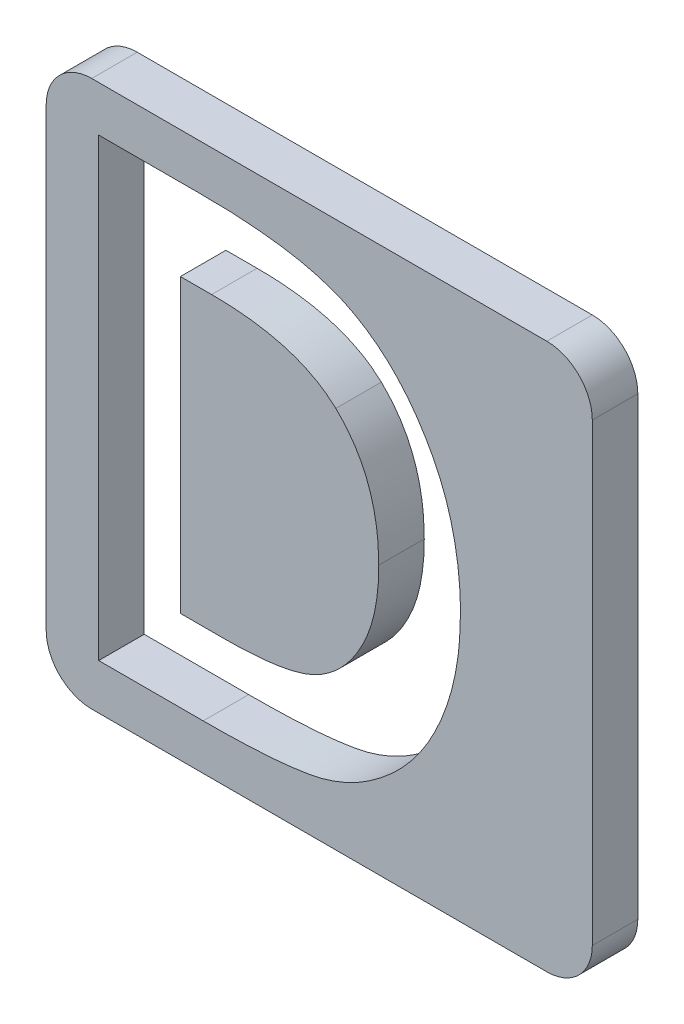
ISO-10303-21;
HEADER;
FILE_DESCRIPTION(('STEP AP214'),'2;1');
FILE_NAME('part.step','',(''),(''),'','','');
FILE_SCHEMA(('AUTOMOTIVE_DESIGN { 1 0 10303 214 1 1 1 1 }'));
ENDSEC;
DATA;
#1=APPLICATION_CONTEXT('core data for automotive mechanical design processes');
#2=APPLICATION_PROTOCOL_DEFINITION('international standard','automotive_design',2000,#1);
#3=PRODUCT_CONTEXT('',#1,'mechanical');
#4=PRODUCT('Part','Part','',(#3));
#5=PRODUCT_RELATED_PRODUCT_CATEGORY('part','',(#4));
#6=PRODUCT_DEFINITION_FORMATION('','',#4);
#7=PRODUCT_DEFINITION_CONTEXT('part definition',#1,'design');
#8=PRODUCT_DEFINITION('design','',#6,#7);
#9=PRODUCT_DEFINITION_SHAPE('','',#8);
#10=(LENGTH_UNIT() NAMED_UNIT(*) SI_UNIT(.MILLI.,.METRE.));
#11=(NAMED_UNIT(*) PLANE_ANGLE_UNIT() SI_UNIT($,.RADIAN.));
#12=(NAMED_UNIT(*) SI_UNIT($,.STERADIAN.) SOLID_ANGLE_UNIT());
#13=UNCERTAINTY_MEASURE_WITH_UNIT(LENGTH_MEASURE(1.E-05),#10,'distance_accuracy_value','');
#14=(GEOMETRIC_REPRESENTATION_CONTEXT(3) GLOBAL_UNCERTAINTY_ASSIGNED_CONTEXT((#13)) GLOBAL_UNIT_ASSIGNED_CONTEXT((#10,
#11,#12)) REPRESENTATION_CONTEXT('',''));
#15=CARTESIAN_POINT('',(0.,0.,0.));
#16=DIRECTION('',(0.,0.,1.));
#17=DIRECTION('',(1.,0.,0.));
#18=AXIS2_PLACEMENT_3D('',#15,#16,#17);
#19=CARTESIAN_POINT('',(50.,50.,10.));
#20=DIRECTION('',(0.,0.,-1.));
#21=DIRECTION('',(-1.,0.,0.));
#22=AXIS2_PLACEMENT_3D('',#19,#20,#21);
#23=PLANE('',#22);
#24=DIRECTION('',(1.,0.,0.));
#25=VECTOR('',#24,1.);
#26=CARTESIAN_POINT('',(-49.9999999999999,60.,10.));
#27=LINE('',#26,#25);
#28=CARTESIAN_POINT('',(-49.9999999999999,60.,10.));
#29=VERTEX_POINT('',#28);
#30=CARTESIAN_POINT('',(49.9999999999999,60.,10.));
#31=VERTEX_POINT('',#30);
#32=EDGE_CURVE('E222',#29,#31,#27,.T.);
#33=ORIENTED_EDGE('',*,*,#32,.F.);
#34=CARTESIAN_POINT('',(-50.,50.,10.));
#35=DIRECTION('',(0.,0.,1.));
#36=DIRECTION('',(1.,0.,0.));
#37=AXIS2_PLACEMENT_3D('',#34,#35,#36);
#38=CIRCLE('',#37,10.);
#39=CARTESIAN_POINT('',(-60.,49.9999999999999,10.));
#40=VERTEX_POINT('',#39);
#41=EDGE_CURVE('E231',#29,#40,#38,.T.);
#42=ORIENTED_EDGE('',*,*,#41,.T.);
#43=DIRECTION('',(0.,-1.,0.));
#44=VECTOR('',#43,1.);
#45=CARTESIAN_POINT('',(-60.,49.9999999999999,10.));
#46=LINE('',#45,#44);
#47=CARTESIAN_POINT('',(-60.,-49.9999999999999,10.));
#48=VERTEX_POINT('',#47);
#49=EDGE_CURVE('E233',#40,#48,#46,.T.);
#50=ORIENTED_EDGE('',*,*,#49,.T.);
#51=CARTESIAN_POINT('',(-50.,-50.,10.));
#52=DIRECTION('',(0.,0.,1.));
#53=DIRECTION('',(1.,0.,0.));
#54=AXIS2_PLACEMENT_3D('',#51,#52,#53);
#55=CIRCLE('',#54,10.);
#56=CARTESIAN_POINT('',(-49.9999999999999,-60.,10.));
#57=VERTEX_POINT('',#56);
#58=EDGE_CURVE('E235',#48,#57,#55,.T.);
#59=ORIENTED_EDGE('',*,*,#58,.T.);
#60=DIRECTION('',(1.,0.,0.));
#61=VECTOR('',#60,1.);
#62=CARTESIAN_POINT('',(-49.9999999999999,-60.,10.));
#63=LINE('',#62,#61);
#64=CARTESIAN_POINT('',(49.9999999999999,-60.,10.));
#65=VERTEX_POINT('',#64);
#66=EDGE_CURVE('E237',#57,#65,#63,.T.);
#67=ORIENTED_EDGE('',*,*,#66,.T.);
#68=CARTESIAN_POINT('',(50.,-50.,10.));
#69=DIRECTION('',(0.,0.,1.));
#70=DIRECTION('',(1.,0.,0.));
#71=AXIS2_PLACEMENT_3D('',#68,#69,#70);
#72=CIRCLE('',#71,10.);
#73=CARTESIAN_POINT('',(60.,-50.,10.));
#74=VERTEX_POINT('',#73);
#75=EDGE_CURVE('E179',#65,#74,#72,.T.);
#76=ORIENTED_EDGE('',*,*,#75,.T.);
#77=DIRECTION('',(0.,-1.,0.));
#78=VECTOR('',#77,1.);
#79=CARTESIAN_POINT('',(60.,49.9999999999999,10.));
#80=LINE('',#79,#78);
#81=CARTESIAN_POINT('',(60.,49.9999999999999,10.));
#82=VERTEX_POINT('',#81);
#83=EDGE_CURVE('E240',#82,#74,#80,.T.);
#84=ORIENTED_EDGE('',*,*,#83,.F.);
#85=CARTESIAN_POINT('',(50.,50.,10.));
#86=DIRECTION('',(0.,0.,-1.));
#87=DIRECTION('',(-1.,0.,0.));
#88=AXIS2_PLACEMENT_3D('',#85,#86,#87);
#89=CIRCLE('',#88,10.);
#90=EDGE_CURVE('E244',#31,#82,#89,.T.);
#91=ORIENTED_EDGE('',*,*,#90,.F.);
#92=EDGE_LOOP('',(#33,#42,#50,#59,#67,#76,#84,#91));
#93=FACE_BOUND('',#92,.T.);
#94=DIRECTION('',(0.,1.,0.));
#95=VECTOR('',#94,1.);
#96=CARTESIAN_POINT('',(-48.4615384615385,-50.,10.));
#97=LINE('',#96,#95);
#98=CARTESIAN_POINT('',(-48.4615384615385,-50.,10.));
#99=VERTEX_POINT('',#98);
#100=CARTESIAN_POINT('',(-48.4615384615385,50.,10.));
#101=VERTEX_POINT('',#100);
#102=EDGE_CURVE('E91',#99,#101,#97,.T.);
#103=ORIENTED_EDGE('',*,*,#102,.T.);
#104=DIRECTION('',(1.,0.,0.));
#105=VECTOR('',#104,1.);
#106=CARTESIAN_POINT('',(-48.4615384615385,50.,10.));
#107=LINE('',#106,#105);
#108=CARTESIAN_POINT('',(-25.8453525641026,50.,10.));
#109=VERTEX_POINT('',#108);
#110=EDGE_CURVE('E81',#101,#109,#107,.T.);
#111=ORIENTED_EDGE('',*,*,#110,.T.);
#112=CARTESIAN_POINT('',(-25.8453525641026,50.,10.));
#113=CARTESIAN_POINT('',(-24.0821607415349,49.9876746858659,10.));
#114=CARTESIAN_POINT('',(-20.6738910123835,49.9638497142842,10.));
#115=CARTESIAN_POINT('',(-15.7359824470738,49.6953995770157,10.));
#116=CARTESIAN_POINT('',(-11.1443558414601,49.282542323938,10.));
#117=CARTESIAN_POINT('',(-6.89605134210413,48.7145823523563,10.));
#118=CARTESIAN_POINT('',(-2.99977865843638,47.9630157781242,10.));
#119=CARTESIAN_POINT('',(0.539438040973813,47.0203228119706,10.));
#120=CARTESIAN_POINT('',(3.73347721862971,45.9321406142939,10.));
#121=CARTESIAN_POINT('',(6.61736085256917,44.6516734431384,10.));
#122=CARTESIAN_POINT('',(9.25006922790466,43.1587758876477,10.));
#123=CARTESIAN_POINT('',(11.7499098550483,41.4958078668595,10.));
#124=CARTESIAN_POINT('',(14.1119743535955,39.6018500023086,10.));
#125=CARTESIAN_POINT('',(16.3694105627592,37.5134405152114,10.));
#126=CARTESIAN_POINT('',(18.4930857897396,35.1923725955692,10.));
#127=CARTESIAN_POINT('',(20.5183668385038,32.67709153939,10.));
#128=CARTESIAN_POINT('',(22.39566563253,29.9311222952212,10.));
#129=CARTESIAN_POINT('',(24.1817288613052,27.0203045524627,10.));
#130=CARTESIAN_POINT('',(25.7969853868829,23.9323025411605,10.));
#131=CARTESIAN_POINT('',(27.2058724850824,20.6934006892036,10.));
#132=CARTESIAN_POINT('',(28.3861057488956,17.324442538754,10.));
#133=CARTESIAN_POINT('',(29.3451063953822,13.8218376576618,10.));
#134=CARTESIAN_POINT('',(30.1095405879083,10.1972136246962,10.));
#135=CARTESIAN_POINT('',(30.6443997871549,6.44325629302305,10.));
#136=CARTESIAN_POINT('',(30.9750550722113,2.56344119610185,10.));
#137=CARTESIAN_POINT('',(31.0085972863244,-0.0660999941568308,10.));
#138=CARTESIAN_POINT('',(31.025641025641,-1.40224358974359,10.));
#139=B_SPLINE_CURVE_WITH_KNOTS('',3,(#112,#113,#114,#115,#116,#117,#118,#119,#120,#121,#122,
#123,#124,#125,#126,#127,#128,#129,#130,#131,#132,#133,#134,#135,#136,#137,#138),.UNSPECIFIED.,
.F.,.F.,(4,1,1,1,1,1,1,1,1,1,1,1,1,1,1,1,1,1,1,1,1,1,1,1,4),(0.,0.0601481616612685,
0.116267076576888,0.168653955243757,0.217398968887108,0.262433522729611,0.303932701069118,
0.342259966836953,0.377441339378056,0.411406099361998,0.445398351286753,0.479766387388168,
0.514584482414878,0.550213651223875,0.587000907728867,0.624662986992,0.663615456017126,
0.703456428361651,0.743450161992313,0.784013385990942,0.825132535849228,0.86726466282793,
0.910306473181936,0.95442420454659,1.),.UNSPECIFIED.);
#140=CARTESIAN_POINT('',(31.025641025641,-1.40224358974359,10.));
#141=VERTEX_POINT('',#140);
#142=EDGE_CURVE('E150',#109,#141,#139,.T.);
#143=ORIENTED_EDGE('',*,*,#142,.T.);
#144=CARTESIAN_POINT('',(31.025641025641,-1.40224358974359,10.));
#145=CARTESIAN_POINT('',(30.9810113152401,-3.28762917478347,10.));
#146=CARTESIAN_POINT('',(30.8931551178541,-6.99912106258618,10.));
#147=CARTESIAN_POINT('',(30.1531035871999,-12.4456926475846,10.));
#148=CARTESIAN_POINT('',(28.9561896811989,-17.6667747458295,10.));
#149=CARTESIAN_POINT('',(27.2732200192437,-22.6215260235735,10.));
#150=CARTESIAN_POINT('',(25.1867881591793,-27.2658236979148,10.));
#151=CARTESIAN_POINT('',(22.6943116664864,-31.5177675195696,10.));
#152=CARTESIAN_POINT('',(19.83233604873,-35.3545352130535,10.));
#153=CARTESIAN_POINT('',(16.6342034926175,-38.75702281808,10.));
#154=CARTESIAN_POINT('',(13.1714048401129,-41.6815070285051,10.));
#155=CARTESIAN_POINT('',(9.57285875894862,-44.186113740478,10.));
#156=CARTESIAN_POINT('',(5.80350885740416,-46.1612051256696,10.));
#157=CARTESIAN_POINT('',(2.48218481240593,-47.4137084192438,10.));
#158=CARTESIAN_POINT('',(-0.397817491169003,-48.1926571057552,10.));
#159=CARTESIAN_POINT('',(-2.9264283571837,-48.6530232807008,10.));
#160=CARTESIAN_POINT('',(-5.79867229952358,-49.075206827398,10.));
#161=CARTESIAN_POINT('',(-9.04133049540728,-49.4014611912279,10.));
#162=CARTESIAN_POINT('',(-12.640178109453,-49.6923999071473,10.));
#163=CARTESIAN_POINT('',(-16.6095601900585,-49.8504846824852,10.));
#164=CARTESIAN_POINT('',(-20.9366250176086,-49.9818296641167,10.));
#165=CARTESIAN_POINT('',(-23.9421806680845,-49.9937845178461,10.));
#166=CARTESIAN_POINT('',(-25.5048076923077,-50.,10.));
#167=B_SPLINE_CURVE_WITH_KNOTS('',3,(#144,#145,#146,#147,#148,#149,#150,#151,#152,#153,#154,
#155,#156,#157,#158,#159,#160,#161,#162,#163,#164,#165,#166),.UNSPECIFIED.,.F.,.F.,(4,1,1,1,1,1,
1,1,1,1,1,1,1,1,1,1,1,1,1,1,4),(0.,0.0657729465461661,0.129477895386483,0.191430088272385,
0.252445668458904,0.311786958386193,0.368817549923748,0.424091517952963,0.478492105709116,
0.531393743956255,0.582003970220511,0.631201270743863,0.67950300774134,0.70556137429383,
0.735221722948122,0.769132485752424,0.806858319911334,0.848929771369736,0.89511666132536,
0.945469803768964,1.),.UNSPECIFIED.);
#168=CARTESIAN_POINT('',(-25.5048076923077,-50.,10.));
#169=VERTEX_POINT('',#168);
#170=EDGE_CURVE('E159',#141,#169,#167,.T.);
#171=ORIENTED_EDGE('',*,*,#170,.T.);
#172=DIRECTION('',(-1.,0.,0.));
#173=VECTOR('',#172,1.);
#174=CARTESIAN_POINT('',(-25.5048076923077,-50.,10.));
#175=LINE('',#174,#173);
#176=EDGE_CURVE('E165',#169,#99,#175,.T.);
#177=ORIENTED_EDGE('',*,*,#176,.T.);
#178=EDGE_LOOP('',(#103,#111,#143,#171,#177));
#179=FACE_BOUND('',#178,.T.);
#180=ADVANCED_FACE('F43',(#93,#179),#23,.F.);
#181=CARTESIAN_POINT('',(50.,50.,0.));
#182=DIRECTION('',(0.,0.,-1.));
#183=DIRECTION('',(-1.,0.,0.));
#184=AXIS2_PLACEMENT_3D('',#181,#182,#183);
#185=PLANE('',#184);
#186=DIRECTION('',(1.,0.,0.));
#187=VECTOR('',#186,1.);
#188=CARTESIAN_POINT('',(-49.9999999999999,60.,0.));
#189=LINE('',#188,#187);
#190=CARTESIAN_POINT('',(-49.9999999999999,60.,0.));
#191=VERTEX_POINT('',#190);
#192=CARTESIAN_POINT('',(49.9999999999999,60.,0.));
#193=VERTEX_POINT('',#192);
#194=EDGE_CURVE('E215',#191,#193,#189,.T.);
#195=ORIENTED_EDGE('',*,*,#194,.T.);
#196=CARTESIAN_POINT('',(50.,50.,0.));
#197=DIRECTION('',(0.,0.,-1.));
#198=DIRECTION('',(-1.,0.,0.));
#199=AXIS2_PLACEMENT_3D('',#196,#197,#198);
#200=CIRCLE('',#199,10.);
#201=CARTESIAN_POINT('',(60.,49.9999999999999,0.));
#202=VERTEX_POINT('',#201);
#203=EDGE_CURVE('E225',#193,#202,#200,.T.);
#204=ORIENTED_EDGE('',*,*,#203,.T.);
#205=DIRECTION('',(0.,-1.,0.));
#206=VECTOR('',#205,1.);
#207=CARTESIAN_POINT('',(60.,49.9999999999999,0.));
#208=LINE('',#207,#206);
#209=CARTESIAN_POINT('',(60.,-50.,0.));
#210=VERTEX_POINT('',#209);
#211=EDGE_CURVE('E227',#202,#210,#208,.T.);
#212=ORIENTED_EDGE('',*,*,#211,.T.);
#213=CARTESIAN_POINT('',(50.,-50.,0.));
#214=DIRECTION('',(0.,0.,1.));
#215=DIRECTION('',(1.,0.,0.));
#216=AXIS2_PLACEMENT_3D('',#213,#214,#215);
#217=CIRCLE('',#216,10.);
#218=CARTESIAN_POINT('',(49.9999999999999,-60.,0.));
#219=VERTEX_POINT('',#218);
#220=EDGE_CURVE('E258',#219,#210,#217,.T.);
#221=ORIENTED_EDGE('',*,*,#220,.F.);
#222=DIRECTION('',(1.,0.,0.));
#223=VECTOR('',#222,1.);
#224=CARTESIAN_POINT('',(-49.9999999999999,-60.,0.));
#225=LINE('',#224,#223);
#226=CARTESIAN_POINT('',(-49.9999999999999,-60.,0.));
#227=VERTEX_POINT('',#226);
#228=EDGE_CURVE('E262',#227,#219,#225,.T.);
#229=ORIENTED_EDGE('',*,*,#228,.F.);
#230=CARTESIAN_POINT('',(-50.,-50.,0.));
#231=DIRECTION('',(0.,0.,1.));
#232=DIRECTION('',(1.,0.,0.));
#233=AXIS2_PLACEMENT_3D('',#230,#231,#232);
#234=CIRCLE('',#233,10.);
#235=CARTESIAN_POINT('',(-60.,-49.9999999999999,0.));
#236=VERTEX_POINT('',#235);
#237=EDGE_CURVE('E266',#236,#227,#234,.T.);
#238=ORIENTED_EDGE('',*,*,#237,.F.);
#239=DIRECTION('',(0.,-1.,0.));
#240=VECTOR('',#239,1.);
#241=CARTESIAN_POINT('',(-60.,49.9999999999999,0.));
#242=LINE('',#241,#240);
#243=CARTESIAN_POINT('',(-60.,49.9999999999999,0.));
#244=VERTEX_POINT('',#243);
#245=EDGE_CURVE('E270',#244,#236,#242,.T.);
#246=ORIENTED_EDGE('',*,*,#245,.F.);
#247=CARTESIAN_POINT('',(-50.,50.,0.));
#248=DIRECTION('',(0.,0.,1.));
#249=DIRECTION('',(1.,0.,0.));
#250=AXIS2_PLACEMENT_3D('',#247,#248,#249);
#251=CIRCLE('',#250,10.);
#252=EDGE_CURVE('E273',#191,#244,#251,.T.);
#253=ORIENTED_EDGE('',*,*,#252,.F.);
#254=EDGE_LOOP('',(#195,#204,#212,#221,#229,#238,#246,#253));
#255=FACE_BOUND('',#254,.T.);
#256=DIRECTION('',(1.,0.,0.));
#257=VECTOR('',#256,1.);
#258=CARTESIAN_POINT('',(-48.4615384615385,50.,0.));
#259=LINE('',#258,#257);
#260=CARTESIAN_POINT('',(-48.4615384615385,50.,0.));
#261=VERTEX_POINT('',#260);
#262=CARTESIAN_POINT('',(-25.8453525641026,50.,0.));
#263=VERTEX_POINT('',#262);
#264=EDGE_CURVE('E77',#261,#263,#259,.T.);
#265=ORIENTED_EDGE('',*,*,#264,.F.);
#266=DIRECTION('',(0.,1.,0.));
#267=VECTOR('',#266,1.);
#268=CARTESIAN_POINT('',(-48.4615384615385,-50.,0.));
#269=LINE('',#268,#267);
#270=CARTESIAN_POINT('',(-48.4615384615385,-50.,0.));
#271=VERTEX_POINT('',#270);
#272=EDGE_CURVE('E46',#271,#261,#269,.T.);
#273=ORIENTED_EDGE('',*,*,#272,.F.);
#274=DIRECTION('',(-1.,0.,0.));
#275=VECTOR('',#274,1.);
#276=CARTESIAN_POINT('',(-25.5048076923077,-50.,0.));
#277=LINE('',#276,#275);
#278=CARTESIAN_POINT('',(-25.5048076923077,-50.,0.));
#279=VERTEX_POINT('',#278);
#280=EDGE_CURVE('E52',#279,#271,#277,.T.);
#281=ORIENTED_EDGE('',*,*,#280,.F.);
#282=CARTESIAN_POINT('',(31.025641025641,-1.40224358974359,0.));
#283=CARTESIAN_POINT('',(30.9810113152401,-3.28762917478347,0.));
#284=CARTESIAN_POINT('',(30.8931551178541,-6.99912106258618,0.));
#285=CARTESIAN_POINT('',(30.1531035871999,-12.4456926475846,0.));
#286=CARTESIAN_POINT('',(28.9561896811989,-17.6667747458295,0.));
#287=CARTESIAN_POINT('',(27.2732200192437,-22.6215260235735,0.));
#288=CARTESIAN_POINT('',(25.1867881591793,-27.2658236979148,0.));
#289=CARTESIAN_POINT('',(22.6943116664864,-31.5177675195696,0.));
#290=CARTESIAN_POINT('',(19.83233604873,-35.3545352130535,0.));
#291=CARTESIAN_POINT('',(16.6342034926175,-38.75702281808,0.));
#292=CARTESIAN_POINT('',(13.1714048401129,-41.6815070285051,0.));
#293=CARTESIAN_POINT('',(9.57285875894862,-44.186113740478,0.));
#294=CARTESIAN_POINT('',(5.80350885740416,-46.1612051256696,0.));
#295=CARTESIAN_POINT('',(2.48218481240593,-47.4137084192438,0.));
#296=CARTESIAN_POINT('',(-0.397817491169003,-48.1926571057552,0.));
#297=CARTESIAN_POINT('',(-2.9264283571837,-48.6530232807008,0.));
#298=CARTESIAN_POINT('',(-5.79867229952358,-49.075206827398,0.));
#299=CARTESIAN_POINT('',(-9.04133049540728,-49.4014611912279,0.));
#300=CARTESIAN_POINT('',(-12.640178109453,-49.6923999071473,0.));
#301=CARTESIAN_POINT('',(-16.6095601900585,-49.8504846824852,0.));
#302=CARTESIAN_POINT('',(-20.9366250176086,-49.9818296641167,0.));
#303=CARTESIAN_POINT('',(-23.9421806680845,-49.9937845178461,0.));
#304=CARTESIAN_POINT('',(-25.5048076923077,-50.,0.));
#305=B_SPLINE_CURVE_WITH_KNOTS('',3,(#282,#283,#284,#285,#286,#287,#288,#289,#290,#291,#292,
#293,#294,#295,#296,#297,#298,#299,#300,#301,#302,#303,#304),.UNSPECIFIED.,.F.,.F.,(4,1,1,1,1,1,
1,1,1,1,1,1,1,1,1,1,1,1,1,1,4),(0.,0.0657729465461661,0.129477895386483,0.191430088272385,
0.252445668458904,0.311786958386193,0.368817549923748,0.424091517952963,0.478492105709116,
0.531393743956255,0.582003970220511,0.631201270743863,0.67950300774134,0.70556137429383,
0.735221722948122,0.769132485752424,0.806858319911334,0.848929771369736,0.89511666132536,
0.945469803768964,1.),.UNSPECIFIED.);
#306=CARTESIAN_POINT('',(31.025641025641,-1.40224358974359,0.));
#307=VERTEX_POINT('',#306);
#308=EDGE_CURVE('E156',#307,#279,#305,.T.);
#309=ORIENTED_EDGE('',*,*,#308,.F.);
#310=CARTESIAN_POINT('',(-25.8453525641026,50.,0.));
#311=CARTESIAN_POINT('',(-24.0821607415349,49.9876746858659,0.));
#312=CARTESIAN_POINT('',(-20.6738910123835,49.9638497142842,0.));
#313=CARTESIAN_POINT('',(-15.7359824470738,49.6953995770157,0.));
#314=CARTESIAN_POINT('',(-11.1443558414601,49.282542323938,0.));
#315=CARTESIAN_POINT('',(-6.89605134210413,48.7145823523563,0.));
#316=CARTESIAN_POINT('',(-2.99977865843638,47.9630157781242,0.));
#317=CARTESIAN_POINT('',(0.539438040973813,47.0203228119706,0.));
#318=CARTESIAN_POINT('',(3.73347721862971,45.9321406142939,0.));
#319=CARTESIAN_POINT('',(6.61736085256917,44.6516734431384,0.));
#320=CARTESIAN_POINT('',(9.25006922790466,43.1587758876477,0.));
#321=CARTESIAN_POINT('',(11.7499098550483,41.4958078668595,0.));
#322=CARTESIAN_POINT('',(14.1119743535955,39.6018500023086,0.));
#323=CARTESIAN_POINT('',(16.3694105627592,37.5134405152114,0.));
#324=CARTESIAN_POINT('',(18.4930857897396,35.1923725955692,0.));
#325=CARTESIAN_POINT('',(20.5183668385038,32.67709153939,0.));
#326=CARTESIAN_POINT('',(22.39566563253,29.9311222952212,0.));
#327=CARTESIAN_POINT('',(24.1817288613052,27.0203045524627,0.));
#328=CARTESIAN_POINT('',(25.7969853868829,23.9323025411605,0.));
#329=CARTESIAN_POINT('',(27.2058724850824,20.6934006892036,0.));
#330=CARTESIAN_POINT('',(28.3861057488956,17.324442538754,0.));
#331=CARTESIAN_POINT('',(29.3451063953822,13.8218376576618,0.));
#332=CARTESIAN_POINT('',(30.1095405879083,10.1972136246962,0.));
#333=CARTESIAN_POINT('',(30.6443997871549,6.44325629302305,0.));
#334=CARTESIAN_POINT('',(30.9750550722113,2.56344119610185,0.));
#335=CARTESIAN_POINT('',(31.0085972863244,-0.0660999941568308,0.));
#336=CARTESIAN_POINT('',(31.025641025641,-1.40224358974359,0.));
#337=B_SPLINE_CURVE_WITH_KNOTS('',3,(#310,#311,#312,#313,#314,#315,#316,#317,#318,#319,#320,
#321,#322,#323,#324,#325,#326,#327,#328,#329,#330,#331,#332,#333,#334,#335,#336),.UNSPECIFIED.,
.F.,.F.,(4,1,1,1,1,1,1,1,1,1,1,1,1,1,1,1,1,1,1,1,1,1,1,1,4),(0.,0.0601481616612685,
0.116267076576888,0.168653955243757,0.217398968887108,0.262433522729611,0.303932701069118,
0.342259966836953,0.377441339378056,0.411406099361998,0.445398351286753,0.479766387388168,
0.514584482414878,0.550213651223875,0.587000907728867,0.624662986992,0.663615456017126,
0.703456428361651,0.743450161992313,0.784013385990942,0.825132535849228,0.86726466282793,
0.910306473181936,0.95442420454659,1.),.UNSPECIFIED.);
#338=EDGE_CURVE('E152',#263,#307,#337,.T.);
#339=ORIENTED_EDGE('',*,*,#338,.F.);
#340=EDGE_LOOP('',(#265,#273,#281,#309,#339));
#341=FACE_BOUND('',#340,.T.);
#342=ADVANCED_FACE('F198',(#255,#341),#185,.T.);
#343=CARTESIAN_POINT('',(-49.9999999999999,60.,10.));
#344=DIRECTION('',(0.,1.,0.));
#345=DIRECTION('',(0.,0.,1.));
#346=AXIS2_PLACEMENT_3D('',#343,#344,#345);
#347=PLANE('',#346);
#348=ORIENTED_EDGE('',*,*,#194,.F.);
#349=DIRECTION('',(0.,0.,-1.));
#350=VECTOR('',#349,1.);
#351=CARTESIAN_POINT('',(-49.9999999999999,60.,10.));
#352=LINE('',#351,#350);
#353=EDGE_CURVE('E271',#29,#191,#352,.T.);
#354=ORIENTED_EDGE('',*,*,#353,.F.);
#355=ORIENTED_EDGE('',*,*,#32,.T.);
#356=DIRECTION('',(0.,0.,-1.));
#357=VECTOR('',#356,1.);
#358=CARTESIAN_POINT('',(49.9999999999999,60.,10.));
#359=LINE('',#358,#357);
#360=EDGE_CURVE('E275',#31,#193,#359,.T.);
#361=ORIENTED_EDGE('',*,*,#360,.T.);
#362=EDGE_LOOP('',(#348,#354,#355,#361));
#363=FACE_BOUND('',#362,.T.);
#364=ADVANCED_FACE('F200',(#363),#347,.T.);
#365=CARTESIAN_POINT('',(-50.,50.,10.));
#366=DIRECTION('',(0.,0.,-1.));
#367=DIRECTION('',(-1.,0.,0.));
#368=AXIS2_PLACEMENT_3D('',#365,#366,#367);
#369=CYLINDRICAL_SURFACE('',#368,10.);
#370=ORIENTED_EDGE('',*,*,#252,.T.);
#371=DIRECTION('',(0.,0.,-1.));
#372=VECTOR('',#371,1.);
#373=CARTESIAN_POINT('',(-60.,49.9999999999999,10.));
#374=LINE('',#373,#372);
#375=EDGE_CURVE('E267',#40,#244,#374,.T.);
#376=ORIENTED_EDGE('',*,*,#375,.F.);
#377=ORIENTED_EDGE('',*,*,#41,.F.);
#378=ORIENTED_EDGE('',*,*,#353,.T.);
#379=EDGE_LOOP('',(#370,#376,#377,#378));
#380=FACE_BOUND('',#379,.T.);
#381=ADVANCED_FACE('F206',(#380),#369,.T.);
#382=CARTESIAN_POINT('',(-60.,49.9999999999999,10.));
#383=DIRECTION('',(1.,0.,0.));
#384=DIRECTION('',(0.,1.,0.));
#385=AXIS2_PLACEMENT_3D('',#382,#383,#384);
#386=PLANE('',#385);
#387=ORIENTED_EDGE('',*,*,#245,.T.);
#388=DIRECTION('',(0.,0.,-1.));
#389=VECTOR('',#388,1.);
#390=CARTESIAN_POINT('',(-60.,-49.9999999999999,10.));
#391=LINE('',#390,#389);
#392=EDGE_CURVE('E263',#48,#236,#391,.T.);
#393=ORIENTED_EDGE('',*,*,#392,.F.);
#394=ORIENTED_EDGE('',*,*,#49,.F.);
#395=ORIENTED_EDGE('',*,*,#375,.T.);
#396=EDGE_LOOP('',(#387,#393,#394,#395));
#397=FACE_BOUND('',#396,.T.);
#398=ADVANCED_FACE('F306',(#397),#386,.F.);
#399=CARTESIAN_POINT('',(-50.,-50.,10.));
#400=DIRECTION('',(0.,0.,-1.));
#401=DIRECTION('',(-1.,0.,0.));
#402=AXIS2_PLACEMENT_3D('',#399,#400,#401);
#403=CYLINDRICAL_SURFACE('',#402,10.);
#404=ORIENTED_EDGE('',*,*,#237,.T.);
#405=DIRECTION('',(0.,0.,-1.));
#406=VECTOR('',#405,1.);
#407=CARTESIAN_POINT('',(-49.9999999999999,-60.,10.));
#408=LINE('',#407,#406);
#409=EDGE_CURVE('E259',#57,#227,#408,.T.);
#410=ORIENTED_EDGE('',*,*,#409,.F.);
#411=ORIENTED_EDGE('',*,*,#58,.F.);
#412=ORIENTED_EDGE('',*,*,#392,.T.);
#413=EDGE_LOOP('',(#404,#410,#411,#412));
#414=FACE_BOUND('',#413,.T.);
#415=ADVANCED_FACE('F302',(#414),#403,.T.);
#416=CARTESIAN_POINT('',(-49.9999999999999,-60.,10.));
#417=DIRECTION('',(0.,1.,0.));
#418=DIRECTION('',(0.,0.,1.));
#419=AXIS2_PLACEMENT_3D('',#416,#417,#418);
#420=PLANE('',#419);
#421=ORIENTED_EDGE('',*,*,#228,.T.);
#422=DIRECTION('',(0.,0.,-1.));
#423=VECTOR('',#422,1.);
#424=CARTESIAN_POINT('',(49.9999999999999,-60.,10.));
#425=LINE('',#424,#423);
#426=EDGE_CURVE('E243',#65,#219,#425,.T.);
#427=ORIENTED_EDGE('',*,*,#426,.F.);
#428=ORIENTED_EDGE('',*,*,#66,.F.);
#429=ORIENTED_EDGE('',*,*,#409,.T.);
#430=EDGE_LOOP('',(#421,#427,#428,#429));
#431=FACE_BOUND('',#430,.T.);
#432=ADVANCED_FACE('F296',(#431),#420,.F.);
#433=CARTESIAN_POINT('',(50.,-50.,10.));
#434=DIRECTION('',(0.,0.,-1.));
#435=DIRECTION('',(-1.,0.,0.));
#436=AXIS2_PLACEMENT_3D('',#433,#434,#435);
#437=CYLINDRICAL_SURFACE('',#436,10.);
#438=ORIENTED_EDGE('',*,*,#220,.T.);
#439=DIRECTION('',(0.,0.,-1.));
#440=VECTOR('',#439,1.);
#441=CARTESIAN_POINT('',(60.,-50.,10.));
#442=LINE('',#441,#440);
#443=EDGE_CURVE('E242',#74,#210,#442,.T.);
#444=ORIENTED_EDGE('',*,*,#443,.F.);
#445=ORIENTED_EDGE('',*,*,#75,.F.);
#446=ORIENTED_EDGE('',*,*,#426,.T.);
#447=EDGE_LOOP('',(#438,#444,#445,#446));
#448=FACE_BOUND('',#447,.T.);
#449=ADVANCED_FACE('F288',(#448),#437,.T.);
#450=CARTESIAN_POINT('',(60.,49.9999999999999,10.));
#451=DIRECTION('',(1.,0.,0.));
#452=DIRECTION('',(0.,1.,0.));
#453=AXIS2_PLACEMENT_3D('',#450,#451,#452);
#454=PLANE('',#453);
#455=ORIENTED_EDGE('',*,*,#211,.F.);
#456=DIRECTION('',(0.,0.,-1.));
#457=VECTOR('',#456,1.);
#458=CARTESIAN_POINT('',(60.,49.9999999999999,10.));
#459=LINE('',#458,#457);
#460=EDGE_CURVE('E220',#82,#202,#459,.T.);
#461=ORIENTED_EDGE('',*,*,#460,.F.);
#462=ORIENTED_EDGE('',*,*,#83,.T.);
#463=ORIENTED_EDGE('',*,*,#443,.T.);
#464=EDGE_LOOP('',(#455,#461,#462,#463));
#465=FACE_BOUND('',#464,.T.);
#466=ADVANCED_FACE('F286',(#465),#454,.T.);
#467=CARTESIAN_POINT('',(50.,50.,10.));
#468=DIRECTION('',(0.,0.,-1.));
#469=DIRECTION('',(-1.,0.,0.));
#470=AXIS2_PLACEMENT_3D('',#467,#468,#469);
#471=CYLINDRICAL_SURFACE('',#470,10.);
#472=ORIENTED_EDGE('',*,*,#203,.F.);
#473=ORIENTED_EDGE('',*,*,#360,.F.);
#474=ORIENTED_EDGE('',*,*,#90,.T.);
#475=ORIENTED_EDGE('',*,*,#460,.T.);
#476=EDGE_LOOP('',(#472,#473,#474,#475));
#477=FACE_BOUND('',#476,.T.);
#478=ADVANCED_FACE('F284',(#477),#471,.T.);
#479=CARTESIAN_POINT('',(-48.4615384615385,-50.,0.));
#480=DIRECTION('',(1.,0.,0.));
#481=DIRECTION('',(0.,0.,-1.));
#482=AXIS2_PLACEMENT_3D('',#479,#480,#481);
#483=PLANE('',#482);
#484=ORIENTED_EDGE('',*,*,#102,.F.);
#485=DIRECTION('',(0.,0.,1.));
#486=VECTOR('',#485,1.);
#487=CARTESIAN_POINT('',(-48.4615384615385,-50.,0.));
#488=LINE('',#487,#486);
#489=EDGE_CURVE('E12',#271,#99,#488,.T.);
#490=ORIENTED_EDGE('',*,*,#489,.F.);
#491=ORIENTED_EDGE('',*,*,#272,.T.);
#492=DIRECTION('',(0.,0.,1.));
#493=VECTOR('',#492,1.);
#494=CARTESIAN_POINT('',(-48.4615384615385,50.,0.));
#495=LINE('',#494,#493);
#496=EDGE_CURVE('E217',#261,#101,#495,.T.);
#497=ORIENTED_EDGE('',*,*,#496,.T.);
#498=EDGE_LOOP('',(#484,#490,#491,#497));
#499=FACE_BOUND('',#498,.T.);
#500=ADVANCED_FACE('F294',(#499),#483,.T.);
#501=CARTESIAN_POINT('',(-48.4615384615385,50.,0.));
#502=DIRECTION('',(0.,-1.,0.));
#503=DIRECTION('',(0.,0.,-1.));
#504=AXIS2_PLACEMENT_3D('',#501,#502,#503);
#505=PLANE('',#504);
#506=ORIENTED_EDGE('',*,*,#110,.F.);
#507=ORIENTED_EDGE('',*,*,#496,.F.);
#508=ORIENTED_EDGE('',*,*,#264,.T.);
#509=DIRECTION('',(0.,0.,1.));
#510=VECTOR('',#509,1.);
#511=CARTESIAN_POINT('',(-25.8453525641026,50.,0.));
#512=LINE('',#511,#510);
#513=EDGE_CURVE('E216',#263,#109,#512,.T.);
#514=ORIENTED_EDGE('',*,*,#513,.T.);
#515=EDGE_LOOP('',(#506,#507,#508,#514));
#516=FACE_BOUND('',#515,.T.);
#517=ADVANCED_FACE('F315',(#516),#505,.T.);
#518=DIRECTION('',(0.,0.,1.));
#519=VECTOR('',#518,1.);
#520=SURFACE_OF_LINEAR_EXTRUSION('',#337,#519);
#521=ORIENTED_EDGE('',*,*,#142,.F.);
#522=ORIENTED_EDGE('',*,*,#513,.F.);
#523=ORIENTED_EDGE('',*,*,#338,.T.);
#524=DIRECTION('',(0.,0.,1.));
#525=VECTOR('',#524,1.);
#526=CARTESIAN_POINT('',(31.025641025641,-1.40224358974359,0.));
#527=LINE('',#526,#525);
#528=EDGE_CURVE('E146',#307,#141,#527,.T.);
#529=ORIENTED_EDGE('',*,*,#528,.T.);
#530=EDGE_LOOP('',(#521,#522,#523,#529));
#531=FACE_BOUND('',#530,.T.);
#532=ADVANCED_FACE('F148',(#531),#520,.T.);
#533=DIRECTION('',(0.,0.,1.));
#534=VECTOR('',#533,1.);
#535=SURFACE_OF_LINEAR_EXTRUSION('',#305,#534);
#536=ORIENTED_EDGE('',*,*,#170,.F.);
#537=ORIENTED_EDGE('',*,*,#528,.F.);
#538=ORIENTED_EDGE('',*,*,#308,.T.);
#539=DIRECTION('',(0.,0.,1.));
#540=VECTOR('',#539,1.);
#541=CARTESIAN_POINT('',(-25.5048076923077,-50.,0.));
#542=LINE('',#541,#540);
#543=EDGE_CURVE('E161',#279,#169,#542,.T.);
#544=ORIENTED_EDGE('',*,*,#543,.T.);
#545=EDGE_LOOP('',(#536,#537,#538,#544));
#546=FACE_BOUND('',#545,.T.);
#547=ADVANCED_FACE('F160',(#546),#535,.T.);
#548=CARTESIAN_POINT('',(-25.5048076923077,-50.,0.));
#549=DIRECTION('',(0.,1.,0.));
#550=DIRECTION('',(0.,0.,1.));
#551=AXIS2_PLACEMENT_3D('',#548,#549,#550);
#552=PLANE('',#551);
#553=ORIENTED_EDGE('',*,*,#176,.F.);
#554=ORIENTED_EDGE('',*,*,#543,.F.);
#555=ORIENTED_EDGE('',*,*,#280,.T.);
#556=ORIENTED_EDGE('',*,*,#489,.T.);
#557=EDGE_LOOP('',(#553,#554,#555,#556));
#558=FACE_BOUND('',#557,.T.);
#559=ADVANCED_FACE('F195',(#558),#552,.T.);
#560=CLOSED_SHELL('',(#180,#342,#364,#381,#398,#415,#432,#449,#466,#478,#500,#517,#532,#547,#559));
#561=MANIFOLD_SOLID_BREP('B2',#560);
#562=CARTESIAN_POINT('',(50.,50.,0.));
#563=DIRECTION('',(0.,0.,-1.));
#564=DIRECTION('',(-1.,0.,0.));
#565=AXIS2_PLACEMENT_3D('',#562,#563,#564);
#566=PLANE('',#565);
#567=DIRECTION('',(0.,-1.,0.));
#568=VECTOR('',#567,1.);
#569=CARTESIAN_POINT('',(-30.5128205128205,32.0512820512821,0.));
#570=LINE('',#569,#568);
#571=CARTESIAN_POINT('',(-30.5128205128205,32.0512820512821,0.));
#572=VERTEX_POINT('',#571);
#573=CARTESIAN_POINT('',(-30.5128205128205,-32.0512820512821,2.10078619059294E-12));
#574=VERTEX_POINT('',#573);
#575=EDGE_CURVE('E495',#572,#574,#570,.T.);
#576=ORIENTED_EDGE('',*,*,#575,.F.);
#577=DIRECTION('',(-1.,0.,0.));
#578=VECTOR('',#577,1.);
#579=CARTESIAN_POINT('',(-23.661858974359,32.0512820512821,0.));
#580=LINE('',#579,#578);
#581=CARTESIAN_POINT('',(-23.661858974359,32.0512820512821,0.));
#582=VERTEX_POINT('',#581);
#583=EDGE_CURVE('E449',#582,#572,#580,.T.);
#584=ORIENTED_EDGE('',*,*,#583,.F.);
#585=CARTESIAN_POINT('',(3.64182692307692,24.0384615384615,0.));
#586=CARTESIAN_POINT('',(2.89804994693118,24.6894464059157,0.));
#587=CARTESIAN_POINT('',(1.37896969317779,26.0190092847863,0.));
#588=CARTESIAN_POINT('',(-1.28803603887287,27.6121656285513,0.));
#589=CARTESIAN_POINT('',(-4.2269382266153,29.0119096321246,0.));
#590=CARTESIAN_POINT('',(-7.50497014403652,30.1217505256493,0.));
#591=CARTESIAN_POINT('',(-11.0904510657198,30.9994600165499,0.));
#592=CARTESIAN_POINT('',(-15.0047361902507,31.6047947913541,0.));
#593=CARTESIAN_POINT('',(-19.2268636738991,31.9937764998413,0.));
#594=CARTESIAN_POINT('',(-22.151855217081,32.0317028650919,0.));
#595=CARTESIAN_POINT('',(-23.661858974359,32.0512820512821,0.));
#596=B_SPLINE_CURVE_WITH_KNOTS('',3,(#585,#586,#587,#588,#589,#590,#591,#592,#593,#594,#595),
.UNSPECIFIED.,.F.,.F.,(4,1,1,1,1,1,1,1,4),(0.,0.101663476092724,0.207636138269122,
0.318744567333375,0.436679941563701,0.563506646376569,0.698681207653684,0.844446555873992,1.),.UNSPECIFIED.);
#597=CARTESIAN_POINT('',(3.64182692307692,24.0384615384615,0.));
#598=VERTEX_POINT('',#597);
#599=EDGE_CURVE('E501',#598,#582,#596,.T.);
#600=ORIENTED_EDGE('',*,*,#599,.F.);
#601=CARTESIAN_POINT('',(13.0769230769231,-1.08173076923077,0.));
#602=CARTESIAN_POINT('',(13.0530050791659,0.228350281132448,0.));
#603=CARTESIAN_POINT('',(13.0063668367784,2.78290682029308,0.));
#604=CARTESIAN_POINT('',(12.5565977194772,6.50367417872357,0.));
#605=CARTESIAN_POINT('',(11.8244593950131,10.0073340434787,0.));
#606=CARTESIAN_POINT('',(10.7797685463817,13.2808833921582,0.));
#607=CARTESIAN_POINT('',(9.46290335447855,16.3335226175368,0.));
#608=CARTESIAN_POINT('',(7.81453959472729,19.1393893980191,0.));
#609=CARTESIAN_POINT('',(5.90561649708916,21.7456184325481,0.));
#610=CARTESIAN_POINT('',(4.39609219364241,23.2745160085858,0.));
#611=CARTESIAN_POINT('',(3.64182692307692,24.0384615384615,0.));
#612=B_SPLINE_CURVE_WITH_KNOTS('',3,(#601,#602,#603,#604,#605,#606,#607,#608,#609,#610,#611),
.UNSPECIFIED.,.F.,.F.,(4,1,1,1,1,1,1,1,4),(0.,0.142276686252781,0.277428514164355,
0.406477151529909,0.530595071691627,0.650142921501853,0.766850696540935,0.883502092643247,1.),.UNSPECIFIED.);
#613=CARTESIAN_POINT('',(13.0769230769231,-1.08173076923077,0.));
#614=VERTEX_POINT('',#613);
#615=EDGE_CURVE('E499',#614,#598,#612,.T.);
#616=ORIENTED_EDGE('',*,*,#615,.F.);
#617=CARTESIAN_POINT('',(-21.1378205128205,-32.0512820512821,0.));
#618=CARTESIAN_POINT('',(-20.0223394907178,-32.0492380281358,0.));
#619=CARTESIAN_POINT('',(-17.8768981387297,-32.0453066911651,0.));
#620=CARTESIAN_POINT('',(-14.7793664707579,-31.8580537271732,0.));
#621=CARTESIAN_POINT('',(-11.914935082459,-31.6701033876275,0.));
#622=CARTESIAN_POINT('',(-9.29148907811049,-31.3133673577135,0.));
#623=CARTESIAN_POINT('',(-6.88993583944927,-30.9159885237041,0.));
#624=CARTESIAN_POINT('',(-4.74326641564306,-30.3629814651188,0.));
#625=CARTESIAN_POINT('',(-2.80722862197613,-29.7820943974075,0.));
#626=CARTESIAN_POINT('',(-1.10547078951899,-29.0425531615174,0.));
#627=CARTESIAN_POINT('',(0.453200729197792,-28.2101502818524,0.));
#628=CARTESIAN_POINT('',(1.89635251905379,-27.2348938066039,0.));
#629=CARTESIAN_POINT('',(3.28939804609916,-26.1519082721718,0.));
#630=CARTESIAN_POINT('',(4.6062932026886,-24.9293415329061,0.));
#631=CARTESIAN_POINT('',(5.85202211825648,-23.5833826690313,0.));
#632=CARTESIAN_POINT('',(7.0192142737605,-22.1070965510644,0.));
#633=CARTESIAN_POINT('',(8.12344859658443,-20.5049873745153,0.));
#634=CARTESIAN_POINT('',(9.13638147906267,-18.7685843884261,0.));
#635=CARTESIAN_POINT('',(10.0620049709822,-16.9162243996799,0.));
#636=CARTESIAN_POINT('',(10.8831367307625,-14.965850216821,0.));
#637=CARTESIAN_POINT('',(11.5639761263222,-12.9012194207962,0.));
#638=CARTESIAN_POINT('',(12.1298481480086,-10.7416594453966,0.));
#639=CARTESIAN_POINT('',(12.5342278715489,-8.46836886545111,0.));
#640=CARTESIAN_POINT('',(12.8687749650793,-6.09818562874492,0.));
#641=CARTESIAN_POINT('',(13.0412437399891,-3.62171926882542,0.));
#642=CARTESIAN_POINT('',(13.0649140035843,-1.9366487916112,0.));
#643=CARTESIAN_POINT('',(13.0769230769231,-1.08173076923077,0.));
#644=B_SPLINE_CURVE_WITH_KNOTS('',3,(#617,#618,#619,#620,#621,#622,#623,#624,#625,#626,#627,
#628,#629,#630,#631,#632,#633,#634,#635,#636,#637,#638,#639,#640,#641,#642,#643),.UNSPECIFIED.,
.F.,.F.,(4,1,1,1,1,1,1,1,1,1,1,1,1,1,1,1,1,1,1,1,1,1,1,1,4),(0.,0.0626146479318152,
0.120428812549278,0.174199485948584,0.223724663959065,0.269028450424391,0.310765001152542,
0.348115257535689,0.382378114434633,0.414753160953367,0.447195431928563,0.480044579173414,
0.513738641199947,0.547962503550267,0.582917814465694,0.619315101115517,0.657123545256098,
0.695686576425778,0.735513715561578,0.775823200286292,0.817652261668176,0.860742583562421,
0.905386927472927,0.951998197137782,1.),.UNSPECIFIED.);
#645=CARTESIAN_POINT('',(-21.1378205128205,-32.0512820512821,0.));
#646=VERTEX_POINT('',#645);
#647=EDGE_CURVE('E482',#646,#614,#644,.T.);
#648=ORIENTED_EDGE('',*,*,#647,.F.);
#649=DIRECTION('',(1.,0.,0.));
#650=VECTOR('',#649,1.);
#651=CARTESIAN_POINT('',(-30.5128205128205,-32.0512820512821,0.));
#652=LINE('',#651,#650);
#653=EDGE_CURVE('E490',#574,#646,#652,.T.);
#654=ORIENTED_EDGE('',*,*,#653,.F.);
#655=EDGE_LOOP('',(#576,#584,#600,#616,#648,#654));
#656=FACE_BOUND('',#655,.T.);
#657=ADVANCED_FACE('F425',(#656),#566,.T.);
#658=CARTESIAN_POINT('',(-30.5128205128205,32.0512820512821,0.));
#659=DIRECTION('',(-1.,0.,0.));
#660=DIRECTION('',(0.,0.,1.));
#661=AXIS2_PLACEMENT_3D('',#658,#659,#660);
#662=PLANE('',#661);
#663=DIRECTION('',(0.,-1.,0.));
#664=VECTOR('',#663,1.);
#665=CARTESIAN_POINT('',(-30.5128205128205,32.0512820512821,10.));
#666=LINE('',#665,#664);
#667=CARTESIAN_POINT('',(-30.5128205128205,32.0512820512821,10.0000000000002));
#668=VERTEX_POINT('',#667);
#669=CARTESIAN_POINT('',(-30.5128205128205,-32.0512820512821,10.));
#670=VERTEX_POINT('',#669);
#671=EDGE_CURVE('E597',#668,#670,#666,.T.);
#672=ORIENTED_EDGE('',*,*,#671,.F.);
#673=DIRECTION('',(0.,0.,1.));
#674=VECTOR('',#673,1.);
#675=CARTESIAN_POINT('',(-30.5128205128205,32.0512820512821,0.));
#676=LINE('',#675,#674);
#677=EDGE_CURVE('E428',#572,#668,#676,.T.);
#678=ORIENTED_EDGE('',*,*,#677,.F.);
#679=ORIENTED_EDGE('',*,*,#575,.T.);
#680=DIRECTION('',(0.,0.,1.));
#681=VECTOR('',#680,1.);
#682=CARTESIAN_POINT('',(-30.5128205128205,-32.0512820512821,0.));
#683=LINE('',#682,#681);
#684=EDGE_CURVE('E487',#574,#670,#683,.T.);
#685=ORIENTED_EDGE('',*,*,#684,.T.);
#686=EDGE_LOOP('',(#672,#678,#679,#685));
#687=FACE_BOUND('',#686,.T.);
#688=ADVANCED_FACE('F522',(#687),#662,.T.);
#689=CARTESIAN_POINT('',(-30.5128205128205,-32.0512820512821,0.));
#690=DIRECTION('',(0.,-1.,0.));
#691=DIRECTION('',(0.,0.,-1.));
#692=AXIS2_PLACEMENT_3D('',#689,#690,#691);
#693=PLANE('',#692);
#694=DIRECTION('',(1.,0.,0.));
#695=VECTOR('',#694,1.);
#696=CARTESIAN_POINT('',(-30.5128205128205,-32.0512820512821,10.));
#697=LINE('',#696,#695);
#698=CARTESIAN_POINT('',(-21.1378205128205,-32.0512820512821,10.));
#699=VERTEX_POINT('',#698);
#700=EDGE_CURVE('E441',#670,#699,#697,.T.);
#701=ORIENTED_EDGE('',*,*,#700,.F.);
#702=ORIENTED_EDGE('',*,*,#684,.F.);
#703=ORIENTED_EDGE('',*,*,#653,.T.);
#704=DIRECTION('',(0.,0.,1.));
#705=VECTOR('',#704,1.);
#706=CARTESIAN_POINT('',(-21.1378205128205,-32.0512820512821,0.));
#707=LINE('',#706,#705);
#708=EDGE_CURVE('E478',#646,#699,#707,.T.);
#709=ORIENTED_EDGE('',*,*,#708,.T.);
#710=EDGE_LOOP('',(#701,#702,#703,#709));
#711=FACE_BOUND('',#710,.T.);
#712=ADVANCED_FACE('F491',(#711),#693,.T.);
#713=DIRECTION('',(0.,0.,1.));
#714=VECTOR('',#713,1.);
#715=SURFACE_OF_LINEAR_EXTRUSION('',#644,#714);
#716=CARTESIAN_POINT('',(-21.1378205128205,-32.0512820512821,10.));
#717=CARTESIAN_POINT('',(-20.0223394907178,-32.0492380281358,10.));
#718=CARTESIAN_POINT('',(-17.8768981387297,-32.0453066911651,10.));
#719=CARTESIAN_POINT('',(-14.7793664707579,-31.8580537271732,10.));
#720=CARTESIAN_POINT('',(-11.914935082459,-31.6701033876275,10.));
#721=CARTESIAN_POINT('',(-9.29148907811049,-31.3133673577135,10.));
#722=CARTESIAN_POINT('',(-6.88993583944927,-30.9159885237041,10.));
#723=CARTESIAN_POINT('',(-4.74326641564306,-30.3629814651188,10.));
#724=CARTESIAN_POINT('',(-2.80722862197613,-29.7820943974075,10.));
#725=CARTESIAN_POINT('',(-1.10547078951899,-29.0425531615174,10.));
#726=CARTESIAN_POINT('',(0.453200729197792,-28.2101502818524,10.));
#727=CARTESIAN_POINT('',(1.89635251905379,-27.2348938066039,10.));
#728=CARTESIAN_POINT('',(3.28939804609916,-26.1519082721718,10.));
#729=CARTESIAN_POINT('',(4.6062932026886,-24.9293415329061,10.));
#730=CARTESIAN_POINT('',(5.85202211825648,-23.5833826690313,10.));
#731=CARTESIAN_POINT('',(7.0192142737605,-22.1070965510644,10.));
#732=CARTESIAN_POINT('',(8.12344859658443,-20.5049873745153,10.));
#733=CARTESIAN_POINT('',(9.13638147906267,-18.7685843884261,10.));
#734=CARTESIAN_POINT('',(10.0620049709822,-16.9162243996799,10.));
#735=CARTESIAN_POINT('',(10.8831367307625,-14.965850216821,10.));
#736=CARTESIAN_POINT('',(11.5639761263222,-12.9012194207962,10.));
#737=CARTESIAN_POINT('',(12.1298481480086,-10.7416594453966,10.));
#738=CARTESIAN_POINT('',(12.5342278715489,-8.46836886545111,10.));
#739=CARTESIAN_POINT('',(12.8687749650793,-6.09818562874492,10.));
#740=CARTESIAN_POINT('',(13.0412437399891,-3.62171926882542,10.));
#741=CARTESIAN_POINT('',(13.0649140035843,-1.9366487916112,10.));
#742=CARTESIAN_POINT('',(13.0769230769231,-1.08173076923077,10.));
#743=B_SPLINE_CURVE_WITH_KNOTS('',3,(#716,#717,#718,#719,#720,#721,#722,#723,#724,#725,#726,
#727,#728,#729,#730,#731,#732,#733,#734,#735,#736,#737,#738,#739,#740,#741,#742),.UNSPECIFIED.,
.F.,.F.,(4,1,1,1,1,1,1,1,1,1,1,1,1,1,1,1,1,1,1,1,1,1,1,1,4),(0.,0.0626146479318152,
0.120428812549278,0.174199485948584,0.223724663959065,0.269028450424391,0.310765001152542,
0.348115257535689,0.382378114434633,0.414753160953367,0.447195431928563,0.480044579173414,
0.513738641199947,0.547962503550267,0.582917814465694,0.619315101115517,0.657123545256098,
0.695686576425778,0.735513715561578,0.775823200286292,0.817652261668176,0.860742583562421,
0.905386927472927,0.951998197137782,1.),.UNSPECIFIED.);
#744=CARTESIAN_POINT('',(13.0769230769231,-1.08173076923077,10.));
#745=VERTEX_POINT('',#744);
#746=EDGE_CURVE('E485',#699,#745,#743,.T.);
#747=ORIENTED_EDGE('',*,*,#746,.F.);
#748=ORIENTED_EDGE('',*,*,#708,.F.);
#749=ORIENTED_EDGE('',*,*,#647,.T.);
#750=DIRECTION('',(0.,0.,1.));
#751=VECTOR('',#750,1.);
#752=CARTESIAN_POINT('',(13.0769230769231,-1.08173076923077,0.));
#753=LINE('',#752,#751);
#754=EDGE_CURVE('E486',#614,#745,#753,.T.);
#755=ORIENTED_EDGE('',*,*,#754,.T.);
#756=EDGE_LOOP('',(#747,#748,#749,#755));
#757=FACE_BOUND('',#756,.T.);
#758=ADVANCED_FACE('F480',(#757),#715,.T.);
#759=DIRECTION('',(0.,0.,1.));
#760=VECTOR('',#759,1.);
#761=SURFACE_OF_LINEAR_EXTRUSION('',#612,#760);
#762=CARTESIAN_POINT('',(13.0769230769231,-1.08173076923077,10.));
#763=CARTESIAN_POINT('',(13.0530050791659,0.228350281132448,10.));
#764=CARTESIAN_POINT('',(13.0063668367784,2.78290682029308,10.));
#765=CARTESIAN_POINT('',(12.5565977194772,6.50367417872357,10.));
#766=CARTESIAN_POINT('',(11.8244593950131,10.0073340434787,10.));
#767=CARTESIAN_POINT('',(10.7797685463817,13.2808833921582,10.));
#768=CARTESIAN_POINT('',(9.46290335447855,16.3335226175368,10.));
#769=CARTESIAN_POINT('',(7.81453959472729,19.1393893980191,10.));
#770=CARTESIAN_POINT('',(5.90561649708916,21.7456184325481,10.));
#771=CARTESIAN_POINT('',(4.39609219364241,23.2745160085858,10.));
#772=CARTESIAN_POINT('',(3.64182692307692,24.0384615384615,10.));
#773=B_SPLINE_CURVE_WITH_KNOTS('',3,(#762,#763,#764,#765,#766,#767,#768,#769,#770,#771,#772),
.UNSPECIFIED.,.F.,.F.,(4,1,1,1,1,1,1,1,4),(0.,0.142276686252781,0.277428514164355,
0.406477151529909,0.530595071691627,0.650142921501853,0.766850696540935,0.883502092643247,1.),.UNSPECIFIED.);
#774=CARTESIAN_POINT('',(3.64182692307692,24.0384615384615,10.));
#775=VERTEX_POINT('',#774);
#776=EDGE_CURVE('E604',#745,#775,#773,.T.);
#777=ORIENTED_EDGE('',*,*,#776,.F.);
#778=ORIENTED_EDGE('',*,*,#754,.F.);
#779=ORIENTED_EDGE('',*,*,#615,.T.);
#780=DIRECTION('',(0.,0.,1.));
#781=VECTOR('',#780,1.);
#782=CARTESIAN_POINT('',(3.64182692307692,24.0384615384615,0.));
#783=LINE('',#782,#781);
#784=EDGE_CURVE('E433',#598,#775,#783,.T.);
#785=ORIENTED_EDGE('',*,*,#784,.T.);
#786=EDGE_LOOP('',(#777,#778,#779,#785));
#787=FACE_BOUND('',#786,.T.);
#788=ADVANCED_FACE('F518',(#787),#761,.T.);
#789=DIRECTION('',(0.,0.,1.));
#790=VECTOR('',#789,1.);
#791=SURFACE_OF_LINEAR_EXTRUSION('',#596,#790);
#792=CARTESIAN_POINT('',(3.64182692307692,24.0384615384615,10.));
#793=CARTESIAN_POINT('',(2.89804994693118,24.6894464059157,10.));
#794=CARTESIAN_POINT('',(1.37896969317779,26.0190092847863,10.));
#795=CARTESIAN_POINT('',(-1.28803603887287,27.6121656285513,10.));
#796=CARTESIAN_POINT('',(-4.2269382266153,29.0119096321246,10.));
#797=CARTESIAN_POINT('',(-7.50497014403652,30.1217505256493,10.));
#798=CARTESIAN_POINT('',(-11.0904510657198,30.9994600165499,10.));
#799=CARTESIAN_POINT('',(-15.0047361902507,31.6047947913541,10.));
#800=CARTESIAN_POINT('',(-19.2268636738991,31.9937764998413,10.));
#801=CARTESIAN_POINT('',(-22.151855217081,32.0317028650919,10.));
#802=CARTESIAN_POINT('',(-23.661858974359,32.0512820512821,10.));
#803=B_SPLINE_CURVE_WITH_KNOTS('',3,(#792,#793,#794,#795,#796,#797,#798,#799,#800,#801,#802),
.UNSPECIFIED.,.F.,.F.,(4,1,1,1,1,1,1,1,4),(0.,0.101663476092724,0.207636138269122,
0.318744567333375,0.436679941563701,0.563506646376569,0.698681207653684,0.844446555873992,1.),.UNSPECIFIED.);
#804=CARTESIAN_POINT('',(-23.661858974359,32.0512820512821,10.));
#805=VERTEX_POINT('',#804);
#806=EDGE_CURVE('E612',#775,#805,#803,.T.);
#807=ORIENTED_EDGE('',*,*,#806,.F.);
#808=ORIENTED_EDGE('',*,*,#784,.F.);
#809=ORIENTED_EDGE('',*,*,#599,.T.);
#810=DIRECTION('',(0.,0.,1.));
#811=VECTOR('',#810,1.);
#812=CARTESIAN_POINT('',(-23.661858974359,32.0512820512821,0.));
#813=LINE('',#812,#811);
#814=EDGE_CURVE('E41',#582,#805,#813,.T.);
#815=ORIENTED_EDGE('',*,*,#814,.T.);
#816=EDGE_LOOP('',(#807,#808,#809,#815));
#817=FACE_BOUND('',#816,.T.);
#818=ADVANCED_FACE('F529',(#817),#791,.T.);
#819=CARTESIAN_POINT('',(-23.661858974359,32.0512820512821,0.));
#820=DIRECTION('',(0.,1.,0.));
#821=DIRECTION('',(0.,0.,1.));
#822=AXIS2_PLACEMENT_3D('',#819,#820,#821);
#823=PLANE('',#822);
#824=DIRECTION('',(-1.,0.,0.));
#825=VECTOR('',#824,1.);
#826=CARTESIAN_POINT('',(-23.661858974359,32.0512820512821,10.));
#827=LINE('',#826,#825);
#828=EDGE_CURVE('E592',#805,#668,#827,.T.);
#829=ORIENTED_EDGE('',*,*,#828,.F.);
#830=ORIENTED_EDGE('',*,*,#814,.F.);
#831=ORIENTED_EDGE('',*,*,#583,.T.);
#832=ORIENTED_EDGE('',*,*,#677,.T.);
#833=EDGE_LOOP('',(#829,#830,#831,#832));
#834=FACE_BOUND('',#833,.T.);
#835=ADVANCED_FACE('F526',(#834),#823,.T.);
#836=CARTESIAN_POINT('',(50.,50.,10.));
#837=DIRECTION('',(0.,0.,-1.));
#838=DIRECTION('',(-1.,0.,0.));
#839=AXIS2_PLACEMENT_3D('',#836,#837,#838);
#840=PLANE('',#839);
#841=ORIENTED_EDGE('',*,*,#828,.T.);
#842=ORIENTED_EDGE('',*,*,#671,.T.);
#843=ORIENTED_EDGE('',*,*,#700,.T.);
#844=ORIENTED_EDGE('',*,*,#746,.T.);
#845=ORIENTED_EDGE('',*,*,#776,.T.);
#846=ORIENTED_EDGE('',*,*,#806,.T.);
#847=EDGE_LOOP('',(#841,#842,#843,#844,#845,#846));
#848=FACE_BOUND('',#847,.T.);
#849=ADVANCED_FACE('F528',(#848),#840,.F.);
#850=CLOSED_SHELL('',(#657,#688,#712,#758,#788,#818,#835,#849));
#851=MANIFOLD_SOLID_BREP('B6',#850);
#852=ADVANCED_BREP_SHAPE_REPRESENTATION('',(#18,#561,#851),#14);
#853=SHAPE_DEFINITION_REPRESENTATION(#9,#852);
ENDSEC;
END-ISO-10303-21;
